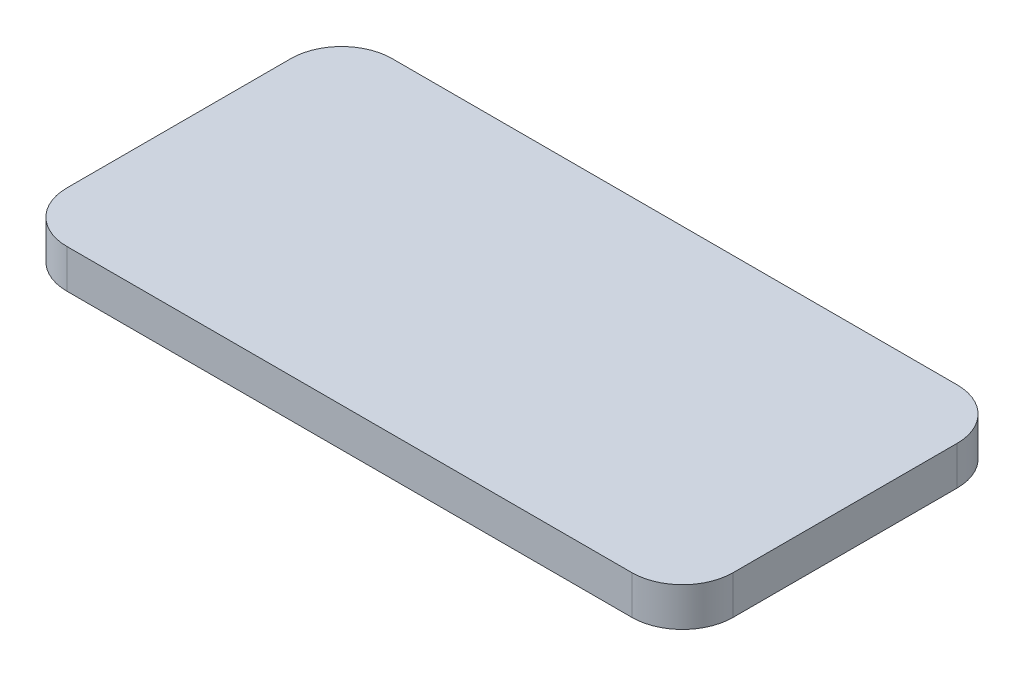
ISO-10303-21;
HEADER;
FILE_DESCRIPTION(('STEP AP214'),'2;1');
FILE_NAME('part.step','',(''),(''),'','','');
FILE_SCHEMA(('AUTOMOTIVE_DESIGN { 1 0 10303 214 1 1 1 1 }'));
ENDSEC;
DATA;
#1=APPLICATION_CONTEXT('core data for automotive mechanical design processes');
#2=APPLICATION_PROTOCOL_DEFINITION('international standard','automotive_design',2000,#1);
#3=PRODUCT_CONTEXT('',#1,'mechanical');
#4=PRODUCT('Part','Part','',(#3));
#5=PRODUCT_RELATED_PRODUCT_CATEGORY('part','',(#4));
#6=PRODUCT_DEFINITION_FORMATION('','',#4);
#7=PRODUCT_DEFINITION_CONTEXT('part definition',#1,'design');
#8=PRODUCT_DEFINITION('design','',#6,#7);
#9=PRODUCT_DEFINITION_SHAPE('','',#8);
#10=(LENGTH_UNIT() NAMED_UNIT(*) SI_UNIT(.MILLI.,.METRE.));
#11=(NAMED_UNIT(*) PLANE_ANGLE_UNIT() SI_UNIT($,.RADIAN.));
#12=(NAMED_UNIT(*) SI_UNIT($,.STERADIAN.) SOLID_ANGLE_UNIT());
#13=UNCERTAINTY_MEASURE_WITH_UNIT(LENGTH_MEASURE(1.E-05),#10,'distance_accuracy_value','');
#14=(GEOMETRIC_REPRESENTATION_CONTEXT(3) GLOBAL_UNCERTAINTY_ASSIGNED_CONTEXT((#13)) GLOBAL_UNIT_ASSIGNED_CONTEXT((#10,
#11,#12)) REPRESENTATION_CONTEXT('',''));
#15=CARTESIAN_POINT('',(0.,0.,0.));
#16=DIRECTION('',(0.,0.,1.));
#17=DIRECTION('',(1.,0.,0.));
#18=AXIS2_PLACEMENT_3D('',#15,#16,#17);
#19=CARTESIAN_POINT('',(65.75,7.65,32.1));
#20=DIRECTION('',(-1.,0.,0.));
#21=DIRECTION('',(0.,0.,1.));
#22=AXIS2_PLACEMENT_3D('',#19,#20,#21);
#23=PLANE('',#22);
#24=DIRECTION('',(0.,0.,-1.));
#25=VECTOR('',#24,1.);
#26=CARTESIAN_POINT('',(65.75,0.,32.1));
#27=LINE('',#26,#25);
#28=CARTESIAN_POINT('',(65.75,0.,22.1));
#29=VERTEX_POINT('',#28);
#30=CARTESIAN_POINT('',(65.75,0.,-22.1));
#31=VERTEX_POINT('',#30);
#32=EDGE_CURVE('E146',#29,#31,#27,.T.);
#33=ORIENTED_EDGE('',*,*,#32,.T.);
#34=DIRECTION('',(0.,-1.,0.));
#35=VECTOR('',#34,1.);
#36=CARTESIAN_POINT('',(65.75,7.65,-22.1));
#37=LINE('',#36,#35);
#38=CARTESIAN_POINT('',(65.75,7.65,-22.1));
#39=VERTEX_POINT('',#38);
#40=EDGE_CURVE('E180',#31,#39,#37,.F.);
#41=ORIENTED_EDGE('',*,*,#40,.T.);
#42=DIRECTION('',(0.,0.,-1.));
#43=VECTOR('',#42,1.);
#44=CARTESIAN_POINT('',(65.75,7.65,32.1));
#45=LINE('',#44,#43);
#46=CARTESIAN_POINT('',(65.75,7.65,22.1));
#47=VERTEX_POINT('',#46);
#48=EDGE_CURVE('E144',#47,#39,#45,.T.);
#49=ORIENTED_EDGE('',*,*,#48,.F.);
#50=DIRECTION('',(0.,-1.,0.));
#51=VECTOR('',#50,1.);
#52=CARTESIAN_POINT('',(65.75,7.65,22.1));
#53=LINE('',#52,#51);
#54=EDGE_CURVE('E176',#47,#29,#53,.T.);
#55=ORIENTED_EDGE('',*,*,#54,.T.);
#56=EDGE_LOOP('',(#33,#41,#49,#55));
#57=FACE_BOUND('',#56,.T.);
#58=ADVANCED_FACE('F45',(#57),#23,.F.);
#59=CARTESIAN_POINT('',(-65.75,7.65,-32.1));
#60=DIRECTION('',(0.,0.,1.));
#61=DIRECTION('',(1.,0.,0.));
#62=AXIS2_PLACEMENT_3D('',#59,#60,#61);
#63=PLANE('',#62);
#64=DIRECTION('',(-1.,0.,0.));
#65=VECTOR('',#64,1.);
#66=CARTESIAN_POINT('',(-65.75,0.,-32.1));
#67=LINE('',#66,#65);
#68=CARTESIAN_POINT('',(55.75,0.,-32.1));
#69=VERTEX_POINT('',#68);
#70=CARTESIAN_POINT('',(-55.75,0.,-32.1));
#71=VERTEX_POINT('',#70);
#72=EDGE_CURVE('E140',#69,#71,#67,.T.);
#73=ORIENTED_EDGE('',*,*,#72,.T.);
#74=DIRECTION('',(0.,-1.,0.));
#75=VECTOR('',#74,1.);
#76=CARTESIAN_POINT('',(-55.75,7.65,-32.1));
#77=LINE('',#76,#75);
#78=CARTESIAN_POINT('',(-55.75,7.65,-32.1));
#79=VERTEX_POINT('',#78);
#80=EDGE_CURVE('E116',#71,#79,#77,.F.);
#81=ORIENTED_EDGE('',*,*,#80,.T.);
#82=DIRECTION('',(-1.,0.,0.));
#83=VECTOR('',#82,1.);
#84=CARTESIAN_POINT('',(-65.75,7.65,-32.1));
#85=LINE('',#84,#83);
#86=CARTESIAN_POINT('',(55.75,7.65,-32.1));
#87=VERTEX_POINT('',#86);
#88=EDGE_CURVE('E199',#87,#79,#85,.T.);
#89=ORIENTED_EDGE('',*,*,#88,.F.);
#90=DIRECTION('',(0.,-1.,0.));
#91=VECTOR('',#90,1.);
#92=CARTESIAN_POINT('',(55.75,7.65,-32.1));
#93=LINE('',#92,#91);
#94=EDGE_CURVE('E122',#87,#69,#93,.T.);
#95=ORIENTED_EDGE('',*,*,#94,.T.);
#96=EDGE_LOOP('',(#73,#81,#89,#95));
#97=FACE_BOUND('',#96,.T.);
#98=ADVANCED_FACE('F220',(#97),#63,.F.);
#99=CARTESIAN_POINT('',(-65.75,7.65,32.1));
#100=DIRECTION('',(1.,0.,0.));
#101=DIRECTION('',(0.,0.,-1.));
#102=AXIS2_PLACEMENT_3D('',#99,#100,#101);
#103=PLANE('',#102);
#104=DIRECTION('',(0.,0.,1.));
#105=VECTOR('',#104,1.);
#106=CARTESIAN_POINT('',(-65.75,7.65,32.1));
#107=LINE('',#106,#105);
#108=CARTESIAN_POINT('',(-65.75,7.65,-22.1));
#109=VERTEX_POINT('',#108);
#110=CARTESIAN_POINT('',(-65.75,7.65,22.1));
#111=VERTEX_POINT('',#110);
#112=EDGE_CURVE('E131',#109,#111,#107,.T.);
#113=ORIENTED_EDGE('',*,*,#112,.F.);
#114=DIRECTION('',(0.,-1.,0.));
#115=VECTOR('',#114,1.);
#116=CARTESIAN_POINT('',(-65.75,7.65,-22.1));
#117=LINE('',#116,#115);
#118=CARTESIAN_POINT('',(-65.75,0.,-22.1));
#119=VERTEX_POINT('',#118);
#120=EDGE_CURVE('E115',#109,#119,#117,.T.);
#121=ORIENTED_EDGE('',*,*,#120,.T.);
#122=DIRECTION('',(0.,0.,1.));
#123=VECTOR('',#122,1.);
#124=CARTESIAN_POINT('',(-65.75,0.,32.1));
#125=LINE('',#124,#123);
#126=CARTESIAN_POINT('',(-65.75,0.,22.1));
#127=VERTEX_POINT('',#126);
#128=EDGE_CURVE('E129',#119,#127,#125,.T.);
#129=ORIENTED_EDGE('',*,*,#128,.T.);
#130=DIRECTION('',(0.,-1.,0.));
#131=VECTOR('',#130,1.);
#132=CARTESIAN_POINT('',(-65.75,7.65,22.1));
#133=LINE('',#132,#131);
#134=EDGE_CURVE('E134',#127,#111,#133,.F.);
#135=ORIENTED_EDGE('',*,*,#134,.T.);
#136=EDGE_LOOP('',(#113,#121,#129,#135));
#137=FACE_BOUND('',#136,.T.);
#138=ADVANCED_FACE('F128',(#137),#103,.F.);
#139=CARTESIAN_POINT('',(-65.75,7.65,32.1));
#140=DIRECTION('',(0.,0.,-1.));
#141=DIRECTION('',(-1.,0.,0.));
#142=AXIS2_PLACEMENT_3D('',#139,#140,#141);
#143=PLANE('',#142);
#144=DIRECTION('',(1.,0.,0.));
#145=VECTOR('',#144,1.);
#146=CARTESIAN_POINT('',(-65.75,0.,32.1));
#147=LINE('',#146,#145);
#148=CARTESIAN_POINT('',(-55.75,0.,32.1));
#149=VERTEX_POINT('',#148);
#150=CARTESIAN_POINT('',(55.75,0.,32.1));
#151=VERTEX_POINT('',#150);
#152=EDGE_CURVE('E139',#149,#151,#147,.T.);
#153=ORIENTED_EDGE('',*,*,#152,.T.);
#154=DIRECTION('',(0.,-1.,0.));
#155=VECTOR('',#154,1.);
#156=CARTESIAN_POINT('',(55.75,7.65,32.1));
#157=LINE('',#156,#155);
#158=CARTESIAN_POINT('',(55.75,7.65,32.1));
#159=VERTEX_POINT('',#158);
#160=EDGE_CURVE('E11',#151,#159,#157,.F.);
#161=ORIENTED_EDGE('',*,*,#160,.T.);
#162=DIRECTION('',(1.,0.,0.));
#163=VECTOR('',#162,1.);
#164=CARTESIAN_POINT('',(-65.75,7.65,32.1));
#165=LINE('',#164,#163);
#166=CARTESIAN_POINT('',(-55.75,7.65,32.1));
#167=VERTEX_POINT('',#166);
#168=EDGE_CURVE('E151',#167,#159,#165,.T.);
#169=ORIENTED_EDGE('',*,*,#168,.F.);
#170=DIRECTION('',(0.,-1.,0.));
#171=VECTOR('',#170,1.);
#172=CARTESIAN_POINT('',(-55.75,7.65,32.1));
#173=LINE('',#172,#171);
#174=EDGE_CURVE('E54',#167,#149,#173,.T.);
#175=ORIENTED_EDGE('',*,*,#174,.T.);
#176=EDGE_LOOP('',(#153,#161,#169,#175));
#177=FACE_BOUND('',#176,.T.);
#178=ADVANCED_FACE('F185',(#177),#143,.F.);
#179=CARTESIAN_POINT('',(0.,7.65,0.));
#180=DIRECTION('',(0.,-1.,0.));
#181=DIRECTION('',(0.,0.,-1.));
#182=AXIS2_PLACEMENT_3D('',#179,#180,#181);
#183=PLANE('',#182);
#184=ORIENTED_EDGE('',*,*,#88,.T.);
#185=CARTESIAN_POINT('',(-55.75,7.65,-22.1));
#186=DIRECTION('',(0.,-1.,0.));
#187=DIRECTION('',(0.,0.,-1.));
#188=AXIS2_PLACEMENT_3D('',#185,#186,#187);
#189=CIRCLE('',#188,10.);
#190=EDGE_CURVE('E173',#79,#109,#189,.F.);
#191=ORIENTED_EDGE('',*,*,#190,.T.);
#192=ORIENTED_EDGE('',*,*,#112,.T.);
#193=CARTESIAN_POINT('',(-55.75,7.65,22.1));
#194=DIRECTION('',(0.,-1.,0.));
#195=DIRECTION('',(0.,0.,-1.));
#196=AXIS2_PLACEMENT_3D('',#193,#194,#195);
#197=CIRCLE('',#196,10.);
#198=EDGE_CURVE('E66',#111,#167,#197,.F.);
#199=ORIENTED_EDGE('',*,*,#198,.T.);
#200=ORIENTED_EDGE('',*,*,#168,.T.);
#201=CARTESIAN_POINT('',(55.75,7.65,22.1));
#202=DIRECTION('',(0.,-1.,0.));
#203=DIRECTION('',(0.,0.,-1.));
#204=AXIS2_PLACEMENT_3D('',#201,#202,#203);
#205=CIRCLE('',#204,10.);
#206=EDGE_CURVE('E167',#159,#47,#205,.F.);
#207=ORIENTED_EDGE('',*,*,#206,.T.);
#208=ORIENTED_EDGE('',*,*,#48,.T.);
#209=CARTESIAN_POINT('',(55.75,7.65,-22.1));
#210=DIRECTION('',(0.,-1.,0.));
#211=DIRECTION('',(0.,0.,-1.));
#212=AXIS2_PLACEMENT_3D('',#209,#210,#211);
#213=CIRCLE('',#212,10.);
#214=EDGE_CURVE('E170',#39,#87,#213,.F.);
#215=ORIENTED_EDGE('',*,*,#214,.T.);
#216=EDGE_LOOP('',(#184,#191,#192,#199,#200,#207,#208,#215));
#217=FACE_BOUND('',#216,.T.);
#218=ADVANCED_FACE('F209',(#217),#183,.F.);
#219=CARTESIAN_POINT('',(0.,0.,0.));
#220=DIRECTION('',(0.,-1.,0.));
#221=DIRECTION('',(0.,0.,-1.));
#222=AXIS2_PLACEMENT_3D('',#219,#220,#221);
#223=PLANE('',#222);
#224=ORIENTED_EDGE('',*,*,#128,.F.);
#225=CARTESIAN_POINT('',(-55.75,0.,-22.1));
#226=DIRECTION('',(0.,-1.,0.));
#227=DIRECTION('',(0.,0.,-1.));
#228=AXIS2_PLACEMENT_3D('',#225,#226,#227);
#229=CIRCLE('',#228,10.);
#230=EDGE_CURVE('E111',#119,#71,#229,.T.);
#231=ORIENTED_EDGE('',*,*,#230,.T.);
#232=ORIENTED_EDGE('',*,*,#72,.F.);
#233=CARTESIAN_POINT('',(55.75,0.,-22.1));
#234=DIRECTION('',(0.,-1.,0.));
#235=DIRECTION('',(0.,0.,-1.));
#236=AXIS2_PLACEMENT_3D('',#233,#234,#235);
#237=CIRCLE('',#236,10.);
#238=EDGE_CURVE('E123',#69,#31,#237,.T.);
#239=ORIENTED_EDGE('',*,*,#238,.T.);
#240=ORIENTED_EDGE('',*,*,#32,.F.);
#241=CARTESIAN_POINT('',(55.75,0.,22.1));
#242=DIRECTION('',(0.,-1.,0.));
#243=DIRECTION('',(0.,0.,-1.));
#244=AXIS2_PLACEMENT_3D('',#241,#242,#243);
#245=CIRCLE('',#244,10.);
#246=EDGE_CURVE('E155',#29,#151,#245,.T.);
#247=ORIENTED_EDGE('',*,*,#246,.T.);
#248=ORIENTED_EDGE('',*,*,#152,.F.);
#249=CARTESIAN_POINT('',(-55.75,0.,22.1));
#250=DIRECTION('',(0.,-1.,0.));
#251=DIRECTION('',(0.,0.,-1.));
#252=AXIS2_PLACEMENT_3D('',#249,#250,#251);
#253=CIRCLE('',#252,10.);
#254=EDGE_CURVE('E133',#149,#127,#253,.T.);
#255=ORIENTED_EDGE('',*,*,#254,.T.);
#256=EDGE_LOOP('',(#224,#231,#232,#239,#240,#247,#248,#255));
#257=FACE_BOUND('',#256,.T.);
#258=ADVANCED_FACE('F136',(#257),#223,.T.);
#259=CARTESIAN_POINT('',(-55.75,7.65,-22.1));
#260=DIRECTION('',(0.,-1.,0.));
#261=DIRECTION('',(0.,0.,-1.));
#262=AXIS2_PLACEMENT_3D('',#259,#260,#261);
#263=CYLINDRICAL_SURFACE('',#262,10.);
#264=ORIENTED_EDGE('',*,*,#190,.F.);
#265=ORIENTED_EDGE('',*,*,#80,.F.);
#266=ORIENTED_EDGE('',*,*,#230,.F.);
#267=ORIENTED_EDGE('',*,*,#120,.F.);
#268=EDGE_LOOP('',(#264,#265,#266,#267));
#269=FACE_BOUND('',#268,.T.);
#270=ADVANCED_FACE('F114',(#269),#263,.T.);
#271=CARTESIAN_POINT('',(55.75,7.65,-22.1));
#272=DIRECTION('',(0.,-1.,0.));
#273=DIRECTION('',(0.,0.,-1.));
#274=AXIS2_PLACEMENT_3D('',#271,#272,#273);
#275=CYLINDRICAL_SURFACE('',#274,10.);
#276=ORIENTED_EDGE('',*,*,#214,.F.);
#277=ORIENTED_EDGE('',*,*,#40,.F.);
#278=ORIENTED_EDGE('',*,*,#238,.F.);
#279=ORIENTED_EDGE('',*,*,#94,.F.);
#280=EDGE_LOOP('',(#276,#277,#278,#279));
#281=FACE_BOUND('',#280,.T.);
#282=ADVANCED_FACE('F231',(#281),#275,.T.);
#283=CARTESIAN_POINT('',(55.75,7.65,22.1));
#284=DIRECTION('',(0.,-1.,0.));
#285=DIRECTION('',(0.,0.,-1.));
#286=AXIS2_PLACEMENT_3D('',#283,#284,#285);
#287=CYLINDRICAL_SURFACE('',#286,10.);
#288=ORIENTED_EDGE('',*,*,#206,.F.);
#289=ORIENTED_EDGE('',*,*,#160,.F.);
#290=ORIENTED_EDGE('',*,*,#246,.F.);
#291=ORIENTED_EDGE('',*,*,#54,.F.);
#292=EDGE_LOOP('',(#288,#289,#290,#291));
#293=FACE_BOUND('',#292,.T.);
#294=ADVANCED_FACE('F192',(#293),#287,.T.);
#295=CARTESIAN_POINT('',(-55.75,7.65,22.1));
#296=DIRECTION('',(0.,-1.,0.));
#297=DIRECTION('',(0.,0.,-1.));
#298=AXIS2_PLACEMENT_3D('',#295,#296,#297);
#299=CYLINDRICAL_SURFACE('',#298,10.);
#300=ORIENTED_EDGE('',*,*,#198,.F.);
#301=ORIENTED_EDGE('',*,*,#134,.F.);
#302=ORIENTED_EDGE('',*,*,#254,.F.);
#303=ORIENTED_EDGE('',*,*,#174,.F.);
#304=EDGE_LOOP('',(#300,#301,#302,#303));
#305=FACE_BOUND('',#304,.T.);
#306=ADVANCED_FACE('F47',(#305),#299,.T.);
#307=CLOSED_SHELL('',(#58,#98,#138,#178,#218,#258,#270,#282,#294,#306));
#308=MANIFOLD_SOLID_BREP('B2',#307);
#309=ADVANCED_BREP_SHAPE_REPRESENTATION('',(#18,#308),#14);
#310=SHAPE_DEFINITION_REPRESENTATION(#9,#309);
ENDSEC;
END-ISO-10303-21;
